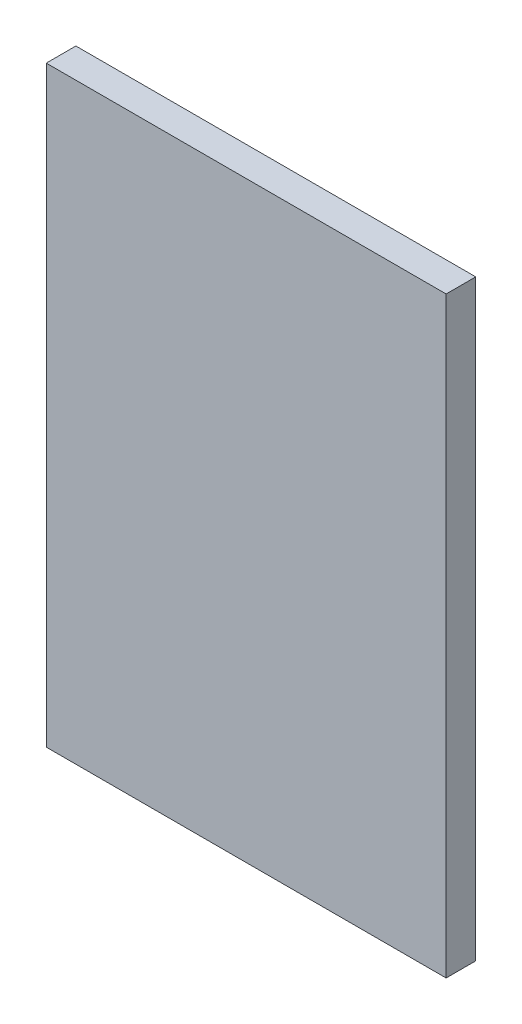
ISO-10303-21;
HEADER;
FILE_DESCRIPTION(('STEP AP214'),'2;1');
FILE_NAME('part.step','',(''),(''),'','','');
FILE_SCHEMA(('AUTOMOTIVE_DESIGN { 1 0 10303 214 1 1 1 1 }'));
ENDSEC;
DATA;
#1=APPLICATION_CONTEXT('core data for automotive mechanical design processes');
#2=APPLICATION_PROTOCOL_DEFINITION('international standard','automotive_design',2000,#1);
#3=PRODUCT_CONTEXT('',#1,'mechanical');
#4=PRODUCT('Part','Part','',(#3));
#5=PRODUCT_RELATED_PRODUCT_CATEGORY('part','',(#4));
#6=PRODUCT_DEFINITION_FORMATION('','',#4);
#7=PRODUCT_DEFINITION_CONTEXT('part definition',#1,'design');
#8=PRODUCT_DEFINITION('design','',#6,#7);
#9=PRODUCT_DEFINITION_SHAPE('','',#8);
#10=(LENGTH_UNIT() NAMED_UNIT(*) SI_UNIT(.MILLI.,.METRE.));
#11=(NAMED_UNIT(*) PLANE_ANGLE_UNIT() SI_UNIT($,.RADIAN.));
#12=(NAMED_UNIT(*) SI_UNIT($,.STERADIAN.) SOLID_ANGLE_UNIT());
#13=UNCERTAINTY_MEASURE_WITH_UNIT(LENGTH_MEASURE(1.E-05),#10,'distance_accuracy_value','');
#14=(GEOMETRIC_REPRESENTATION_CONTEXT(3) GLOBAL_UNCERTAINTY_ASSIGNED_CONTEXT((#13)) GLOBAL_UNIT_ASSIGNED_CONTEXT((#10,
#11,#12)) REPRESENTATION_CONTEXT('',''));
#15=CARTESIAN_POINT('',(0.,0.,0.));
#16=DIRECTION('',(0.,0.,1.));
#17=DIRECTION('',(1.,0.,0.));
#18=AXIS2_PLACEMENT_3D('',#15,#16,#17);
#19=CARTESIAN_POINT('',(-135.,1030.,155.));
#20=DIRECTION('',(1.,0.,0.));
#21=DIRECTION('',(0.,0.,-1.));
#22=AXIS2_PLACEMENT_3D('',#19,#20,#21);
#23=PLANE('',#22);
#24=DIRECTION('',(0.,0.,1.));
#25=VECTOR('',#24,1.);
#26=CARTESIAN_POINT('',(-135.,630.,155.));
#27=LINE('',#26,#25);
#28=CARTESIAN_POINT('',(-135.,630.,135.));
#29=VERTEX_POINT('',#28);
#30=CARTESIAN_POINT('',(-135.,630.,155.));
#31=VERTEX_POINT('',#30);
#32=EDGE_CURVE('E107',#29,#31,#27,.T.);
#33=ORIENTED_EDGE('',*,*,#32,.T.);
#34=DIRECTION('',(0.,-1.,0.));
#35=VECTOR('',#34,1.);
#36=CARTESIAN_POINT('',(-135.,1030.,155.));
#37=LINE('',#36,#35);
#38=CARTESIAN_POINT('',(-135.,1030.,155.));
#39=VERTEX_POINT('',#38);
#40=EDGE_CURVE('E11',#39,#31,#37,.T.);
#41=ORIENTED_EDGE('',*,*,#40,.F.);
#42=DIRECTION('',(0.,0.,1.));
#43=VECTOR('',#42,1.);
#44=CARTESIAN_POINT('',(-135.,1030.,155.));
#45=LINE('',#44,#43);
#46=CARTESIAN_POINT('',(-135.,1030.,135.));
#47=VERTEX_POINT('',#46);
#48=EDGE_CURVE('E91',#47,#39,#45,.T.);
#49=ORIENTED_EDGE('',*,*,#48,.F.);
#50=DIRECTION('',(0.,-1.,0.));
#51=VECTOR('',#50,1.);
#52=CARTESIAN_POINT('',(-135.,1030.,135.));
#53=LINE('',#52,#51);
#54=EDGE_CURVE('E103',#47,#29,#53,.T.);
#55=ORIENTED_EDGE('',*,*,#54,.T.);
#56=EDGE_LOOP('',(#33,#41,#49,#55));
#57=FACE_BOUND('',#56,.T.);
#58=ADVANCED_FACE('F39',(#57),#23,.F.);
#59=CARTESIAN_POINT('',(-135.,1030.,155.));
#60=DIRECTION('',(0.,0.,-1.));
#61=DIRECTION('',(-1.,0.,0.));
#62=AXIS2_PLACEMENT_3D('',#59,#60,#61);
#63=PLANE('',#62);
#64=DIRECTION('',(1.,0.,0.));
#65=VECTOR('',#64,1.);
#66=CARTESIAN_POINT('',(-135.,630.,155.));
#67=LINE('',#66,#65);
#68=CARTESIAN_POINT('',(135.,630.,155.));
#69=VERTEX_POINT('',#68);
#70=EDGE_CURVE('E96',#31,#69,#67,.T.);
#71=ORIENTED_EDGE('',*,*,#70,.T.);
#72=DIRECTION('',(0.,-1.,0.));
#73=VECTOR('',#72,1.);
#74=CARTESIAN_POINT('',(135.,1030.,155.));
#75=LINE('',#74,#73);
#76=CARTESIAN_POINT('',(135.,1030.,155.));
#77=VERTEX_POINT('',#76);
#78=EDGE_CURVE('E48',#77,#69,#75,.T.);
#79=ORIENTED_EDGE('',*,*,#78,.F.);
#80=DIRECTION('',(1.,0.,0.));
#81=VECTOR('',#80,1.);
#82=CARTESIAN_POINT('',(-135.,1030.,155.));
#83=LINE('',#82,#81);
#84=EDGE_CURVE('E86',#39,#77,#83,.T.);
#85=ORIENTED_EDGE('',*,*,#84,.F.);
#86=ORIENTED_EDGE('',*,*,#40,.T.);
#87=EDGE_LOOP('',(#71,#79,#85,#86));
#88=FACE_BOUND('',#87,.T.);
#89=ADVANCED_FACE('F95',(#88),#63,.F.);
#90=CARTESIAN_POINT('',(135.,1030.,155.));
#91=DIRECTION('',(-1.,0.,0.));
#92=DIRECTION('',(0.,0.,1.));
#93=AXIS2_PLACEMENT_3D('',#90,#91,#92);
#94=PLANE('',#93);
#95=DIRECTION('',(0.,0.,-1.));
#96=VECTOR('',#95,1.);
#97=CARTESIAN_POINT('',(135.,630.,155.));
#98=LINE('',#97,#96);
#99=CARTESIAN_POINT('',(135.,630.,135.));
#100=VERTEX_POINT('',#99);
#101=EDGE_CURVE('E73',#69,#100,#98,.T.);
#102=ORIENTED_EDGE('',*,*,#101,.T.);
#103=DIRECTION('',(0.,-1.,0.));
#104=VECTOR('',#103,1.);
#105=CARTESIAN_POINT('',(135.,1030.,135.));
#106=LINE('',#105,#104);
#107=CARTESIAN_POINT('',(135.,1030.,135.));
#108=VERTEX_POINT('',#107);
#109=EDGE_CURVE('E98',#108,#100,#106,.T.);
#110=ORIENTED_EDGE('',*,*,#109,.F.);
#111=DIRECTION('',(0.,0.,-1.));
#112=VECTOR('',#111,1.);
#113=CARTESIAN_POINT('',(135.,1030.,155.));
#114=LINE('',#113,#112);
#115=EDGE_CURVE('E89',#77,#108,#114,.T.);
#116=ORIENTED_EDGE('',*,*,#115,.F.);
#117=ORIENTED_EDGE('',*,*,#78,.T.);
#118=EDGE_LOOP('',(#102,#110,#116,#117));
#119=FACE_BOUND('',#118,.T.);
#120=ADVANCED_FACE('F99',(#119),#94,.F.);
#121=CARTESIAN_POINT('',(-135.,1030.,135.));
#122=DIRECTION('',(0.,0.,1.));
#123=DIRECTION('',(1.,0.,0.));
#124=AXIS2_PLACEMENT_3D('',#121,#122,#123);
#125=PLANE('',#124);
#126=DIRECTION('',(-1.,0.,0.));
#127=VECTOR('',#126,1.);
#128=CARTESIAN_POINT('',(-135.,630.,135.));
#129=LINE('',#128,#127);
#130=EDGE_CURVE('E79',#100,#29,#129,.T.);
#131=ORIENTED_EDGE('',*,*,#130,.T.);
#132=ORIENTED_EDGE('',*,*,#54,.F.);
#133=DIRECTION('',(-1.,0.,0.));
#134=VECTOR('',#133,1.);
#135=CARTESIAN_POINT('',(-135.,1030.,135.));
#136=LINE('',#135,#134);
#137=EDGE_CURVE('E56',#108,#47,#136,.T.);
#138=ORIENTED_EDGE('',*,*,#137,.F.);
#139=ORIENTED_EDGE('',*,*,#109,.T.);
#140=EDGE_LOOP('',(#131,#132,#138,#139));
#141=FACE_BOUND('',#140,.T.);
#142=ADVANCED_FACE('F120',(#141),#125,.F.);
#143=CARTESIAN_POINT('',(0.,1030.,0.));
#144=DIRECTION('',(0.,-1.,0.));
#145=DIRECTION('',(0.,0.,-1.));
#146=AXIS2_PLACEMENT_3D('',#143,#144,#145);
#147=PLANE('',#146);
#148=ORIENTED_EDGE('',*,*,#48,.T.);
#149=ORIENTED_EDGE('',*,*,#84,.T.);
#150=ORIENTED_EDGE('',*,*,#115,.T.);
#151=ORIENTED_EDGE('',*,*,#137,.T.);
#152=EDGE_LOOP('',(#148,#149,#150,#151));
#153=FACE_BOUND('',#152,.T.);
#154=ADVANCED_FACE('F87',(#153),#147,.F.);
#155=CARTESIAN_POINT('',(0.,630.,0.));
#156=DIRECTION('',(0.,-1.,0.));
#157=DIRECTION('',(0.,0.,-1.));
#158=AXIS2_PLACEMENT_3D('',#155,#156,#157);
#159=PLANE('',#158);
#160=ORIENTED_EDGE('',*,*,#32,.F.);
#161=ORIENTED_EDGE('',*,*,#130,.F.);
#162=ORIENTED_EDGE('',*,*,#101,.F.);
#163=ORIENTED_EDGE('',*,*,#70,.F.);
#164=EDGE_LOOP('',(#160,#161,#162,#163));
#165=FACE_BOUND('',#164,.T.);
#166=ADVANCED_FACE('F123',(#165),#159,.T.);
#167=CLOSED_SHELL('',(#58,#89,#120,#142,#154,#166));
#168=MANIFOLD_SOLID_BREP('B2',#167);
#169=ADVANCED_BREP_SHAPE_REPRESENTATION('',(#18,#168),#14);
#170=SHAPE_DEFINITION_REPRESENTATION(#9,#169);
ENDSEC;
END-ISO-10303-21;
